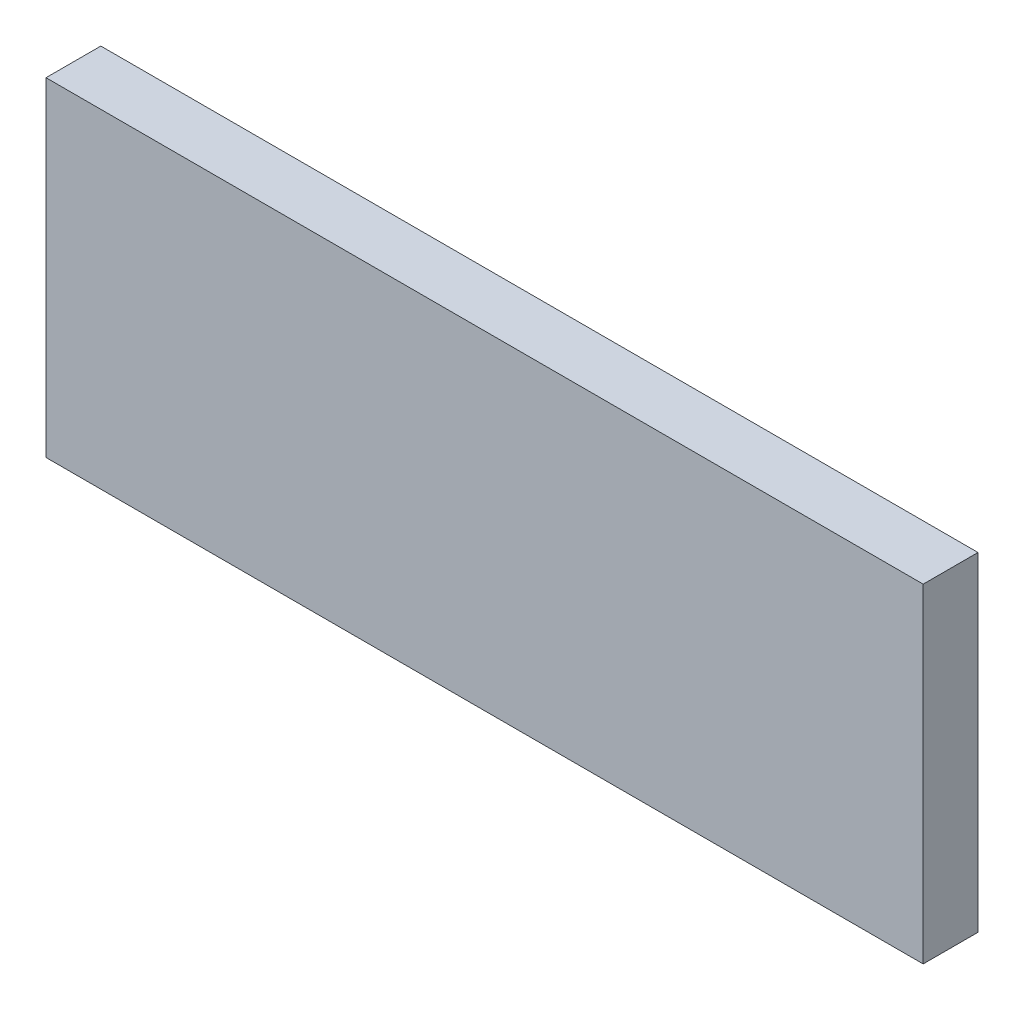
ISO-10303-21;
HEADER;
FILE_DESCRIPTION(('STEP AP214'),'2;1');
FILE_NAME('part.step','',(''),(''),'','','');
FILE_SCHEMA(('AUTOMOTIVE_DESIGN { 1 0 10303 214 1 1 1 1 }'));
ENDSEC;
DATA;
#1=APPLICATION_CONTEXT('core data for automotive mechanical design processes');
#2=APPLICATION_PROTOCOL_DEFINITION('international standard','automotive_design',2000,#1);
#3=PRODUCT_CONTEXT('',#1,'mechanical');
#4=PRODUCT('Part','Part','',(#3));
#5=PRODUCT_RELATED_PRODUCT_CATEGORY('part','',(#4));
#6=PRODUCT_DEFINITION_FORMATION('','',#4);
#7=PRODUCT_DEFINITION_CONTEXT('part definition',#1,'design');
#8=PRODUCT_DEFINITION('design','',#6,#7);
#9=PRODUCT_DEFINITION_SHAPE('','',#8);
#10=(LENGTH_UNIT() NAMED_UNIT(*) SI_UNIT(.MILLI.,.METRE.));
#11=(NAMED_UNIT(*) PLANE_ANGLE_UNIT() SI_UNIT($,.RADIAN.));
#12=(NAMED_UNIT(*) SI_UNIT($,.STERADIAN.) SOLID_ANGLE_UNIT());
#13=UNCERTAINTY_MEASURE_WITH_UNIT(LENGTH_MEASURE(1.E-05),#10,'distance_accuracy_value','');
#14=(GEOMETRIC_REPRESENTATION_CONTEXT(3) GLOBAL_UNCERTAINTY_ASSIGNED_CONTEXT((#13)) GLOBAL_UNIT_ASSIGNED_CONTEXT((#10,
#11,#12)) REPRESENTATION_CONTEXT('',''));
#15=CARTESIAN_POINT('',(0.,0.,0.));
#16=DIRECTION('',(0.,0.,1.));
#17=DIRECTION('',(1.,0.,0.));
#18=AXIS2_PLACEMENT_3D('',#15,#16,#17);
#19=CARTESIAN_POINT('',(101.6,-38.1,12.7));
#20=DIRECTION('',(-1.,0.,0.));
#21=DIRECTION('',(0.,0.,1.));
#22=AXIS2_PLACEMENT_3D('',#19,#20,#21);
#23=PLANE('',#22);
#24=DIRECTION('',(0.,1.,0.));
#25=VECTOR('',#24,1.);
#26=CARTESIAN_POINT('',(101.6,-38.1,0.));
#27=LINE('',#26,#25);
#28=CARTESIAN_POINT('',(101.6,-38.1,0.));
#29=VERTEX_POINT('',#28);
#30=CARTESIAN_POINT('',(101.6,38.1,0.));
#31=VERTEX_POINT('',#30);
#32=EDGE_CURVE('E96',#29,#31,#27,.T.);
#33=ORIENTED_EDGE('',*,*,#32,.T.);
#34=DIRECTION('',(0.,0.,-1.));
#35=VECTOR('',#34,1.);
#36=CARTESIAN_POINT('',(101.6,38.1,12.7));
#37=LINE('',#36,#35);
#38=CARTESIAN_POINT('',(101.6,38.1,12.7));
#39=VERTEX_POINT('',#38);
#40=EDGE_CURVE('E11',#39,#31,#37,.T.);
#41=ORIENTED_EDGE('',*,*,#40,.F.);
#42=DIRECTION('',(0.,1.,0.));
#43=VECTOR('',#42,1.);
#44=CARTESIAN_POINT('',(101.6,-38.1,12.7));
#45=LINE('',#44,#43);
#46=CARTESIAN_POINT('',(101.6,-38.1,12.7));
#47=VERTEX_POINT('',#46);
#48=EDGE_CURVE('E84',#47,#39,#45,.T.);
#49=ORIENTED_EDGE('',*,*,#48,.F.);
#50=DIRECTION('',(0.,0.,-1.));
#51=VECTOR('',#50,1.);
#52=CARTESIAN_POINT('',(101.6,-38.1,12.7));
#53=LINE('',#52,#51);
#54=EDGE_CURVE('E92',#47,#29,#53,.T.);
#55=ORIENTED_EDGE('',*,*,#54,.T.);
#56=EDGE_LOOP('',(#33,#41,#49,#55));
#57=FACE_BOUND('',#56,.T.);
#58=ADVANCED_FACE('F33',(#57),#23,.F.);
#59=CARTESIAN_POINT('',(-101.6,38.1,12.7));
#60=DIRECTION('',(0.,-1.,0.));
#61=DIRECTION('',(0.,0.,-1.));
#62=AXIS2_PLACEMENT_3D('',#59,#60,#61);
#63=PLANE('',#62);
#64=DIRECTION('',(-1.,0.,0.));
#65=VECTOR('',#64,1.);
#66=CARTESIAN_POINT('',(-101.6,38.1,0.));
#67=LINE('',#66,#65);
#68=CARTESIAN_POINT('',(-101.6,38.1,0.));
#69=VERTEX_POINT('',#68);
#70=EDGE_CURVE('E88',#31,#69,#67,.T.);
#71=ORIENTED_EDGE('',*,*,#70,.T.);
#72=DIRECTION('',(0.,0.,-1.));
#73=VECTOR('',#72,1.);
#74=CARTESIAN_POINT('',(-101.6,38.1,12.7));
#75=LINE('',#74,#73);
#76=CARTESIAN_POINT('',(-101.6,38.1,12.7));
#77=VERTEX_POINT('',#76);
#78=EDGE_CURVE('E41',#77,#69,#75,.T.);
#79=ORIENTED_EDGE('',*,*,#78,.F.);
#80=DIRECTION('',(-1.,0.,0.));
#81=VECTOR('',#80,1.);
#82=CARTESIAN_POINT('',(-101.6,38.1,12.7));
#83=LINE('',#82,#81);
#84=EDGE_CURVE('E79',#39,#77,#83,.T.);
#85=ORIENTED_EDGE('',*,*,#84,.F.);
#86=ORIENTED_EDGE('',*,*,#40,.T.);
#87=EDGE_LOOP('',(#71,#79,#85,#86));
#88=FACE_BOUND('',#87,.T.);
#89=ADVANCED_FACE('F87',(#88),#63,.F.);
#90=CARTESIAN_POINT('',(-101.6,-38.1,12.7));
#91=DIRECTION('',(1.,0.,0.));
#92=DIRECTION('',(0.,0.,-1.));
#93=AXIS2_PLACEMENT_3D('',#90,#91,#92);
#94=PLANE('',#93);
#95=DIRECTION('',(0.,-1.,0.));
#96=VECTOR('',#95,1.);
#97=CARTESIAN_POINT('',(-101.6,-38.1,0.));
#98=LINE('',#97,#96);
#99=CARTESIAN_POINT('',(-101.6,-38.1,0.));
#100=VERTEX_POINT('',#99);
#101=EDGE_CURVE('E66',#69,#100,#98,.T.);
#102=ORIENTED_EDGE('',*,*,#101,.T.);
#103=DIRECTION('',(0.,0.,-1.));
#104=VECTOR('',#103,1.);
#105=CARTESIAN_POINT('',(-101.6,-38.1,12.7));
#106=LINE('',#105,#104);
#107=CARTESIAN_POINT('',(-101.6,-38.1,12.7));
#108=VERTEX_POINT('',#107);
#109=EDGE_CURVE('E89',#108,#100,#106,.T.);
#110=ORIENTED_EDGE('',*,*,#109,.F.);
#111=DIRECTION('',(0.,-1.,0.));
#112=VECTOR('',#111,1.);
#113=CARTESIAN_POINT('',(-101.6,-38.1,12.7));
#114=LINE('',#113,#112);
#115=EDGE_CURVE('E82',#77,#108,#114,.T.);
#116=ORIENTED_EDGE('',*,*,#115,.F.);
#117=ORIENTED_EDGE('',*,*,#78,.T.);
#118=EDGE_LOOP('',(#102,#110,#116,#117));
#119=FACE_BOUND('',#118,.T.);
#120=ADVANCED_FACE('F90',(#119),#94,.F.);
#121=CARTESIAN_POINT('',(-101.6,-38.1,12.7));
#122=DIRECTION('',(0.,1.,0.));
#123=DIRECTION('',(0.,0.,1.));
#124=AXIS2_PLACEMENT_3D('',#121,#122,#123);
#125=PLANE('',#124);
#126=DIRECTION('',(1.,0.,0.));
#127=VECTOR('',#126,1.);
#128=CARTESIAN_POINT('',(-101.6,-38.1,0.));
#129=LINE('',#128,#127);
#130=EDGE_CURVE('E72',#100,#29,#129,.T.);
#131=ORIENTED_EDGE('',*,*,#130,.T.);
#132=ORIENTED_EDGE('',*,*,#54,.F.);
#133=DIRECTION('',(1.,0.,0.));
#134=VECTOR('',#133,1.);
#135=CARTESIAN_POINT('',(-101.6,-38.1,12.7));
#136=LINE('',#135,#134);
#137=EDGE_CURVE('E49',#108,#47,#136,.T.);
#138=ORIENTED_EDGE('',*,*,#137,.F.);
#139=ORIENTED_EDGE('',*,*,#109,.T.);
#140=EDGE_LOOP('',(#131,#132,#138,#139));
#141=FACE_BOUND('',#140,.T.);
#142=ADVANCED_FACE('F103',(#141),#125,.F.);
#143=CARTESIAN_POINT('',(0.,0.,12.7));
#144=DIRECTION('',(0.,0.,-1.));
#145=DIRECTION('',(-1.,0.,0.));
#146=AXIS2_PLACEMENT_3D('',#143,#144,#145);
#147=PLANE('',#146);
#148=ORIENTED_EDGE('',*,*,#48,.T.);
#149=ORIENTED_EDGE('',*,*,#84,.T.);
#150=ORIENTED_EDGE('',*,*,#115,.T.);
#151=ORIENTED_EDGE('',*,*,#137,.T.);
#152=EDGE_LOOP('',(#148,#149,#150,#151));
#153=FACE_BOUND('',#152,.T.);
#154=ADVANCED_FACE('F80',(#153),#147,.F.);
#155=CARTESIAN_POINT('',(0.,0.,0.));
#156=DIRECTION('',(0.,0.,-1.));
#157=DIRECTION('',(-1.,0.,0.));
#158=AXIS2_PLACEMENT_3D('',#155,#156,#157);
#159=PLANE('',#158);
#160=ORIENTED_EDGE('',*,*,#32,.F.);
#161=ORIENTED_EDGE('',*,*,#130,.F.);
#162=ORIENTED_EDGE('',*,*,#101,.F.);
#163=ORIENTED_EDGE('',*,*,#70,.F.);
#164=EDGE_LOOP('',(#160,#161,#162,#163));
#165=FACE_BOUND('',#164,.T.);
#166=ADVANCED_FACE('F106',(#165),#159,.T.);
#167=CLOSED_SHELL('',(#58,#89,#120,#142,#154,#166));
#168=MANIFOLD_SOLID_BREP('B2',#167);
#169=ADVANCED_BREP_SHAPE_REPRESENTATION('',(#18,#168),#14);
#170=SHAPE_DEFINITION_REPRESENTATION(#9,#169);
ENDSEC;
END-ISO-10303-21;
